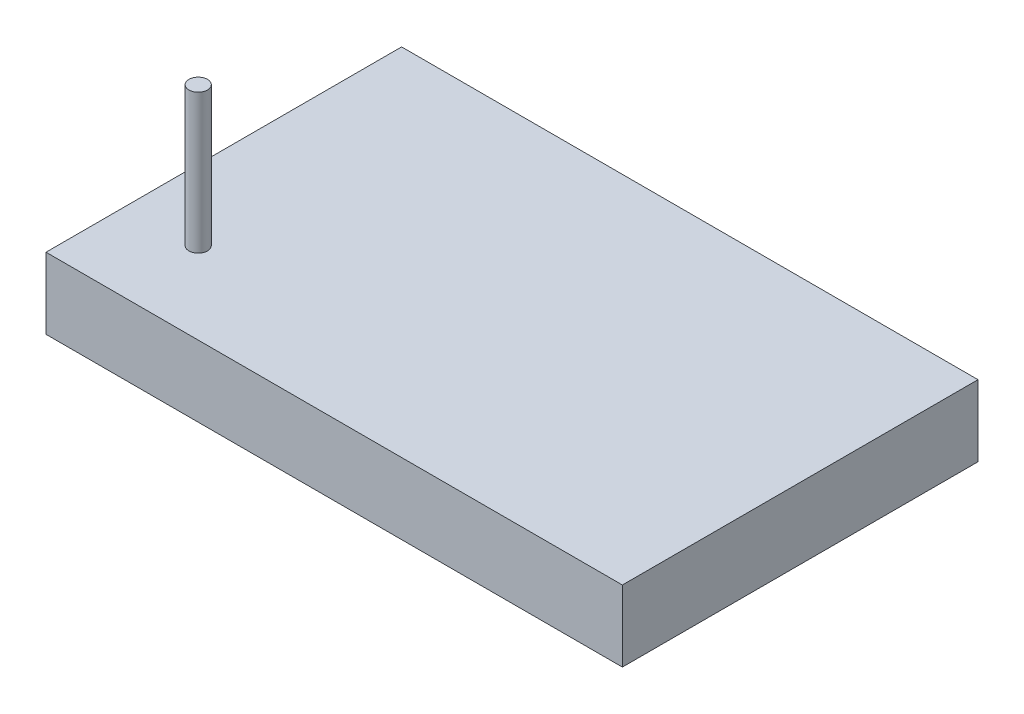
ISO-10303-21;
HEADER;
FILE_DESCRIPTION(('STEP AP214'),'2;1');
FILE_NAME('part.step','',(''),(''),'','','');
FILE_SCHEMA(('AUTOMOTIVE_DESIGN { 1 0 10303 214 1 1 1 1 }'));
ENDSEC;
DATA;
#1=APPLICATION_CONTEXT('core data for automotive mechanical design processes');
#2=APPLICATION_PROTOCOL_DEFINITION('international standard','automotive_design',2000,#1);
#3=PRODUCT_CONTEXT('',#1,'mechanical');
#4=PRODUCT('Part','Part','',(#3));
#5=PRODUCT_RELATED_PRODUCT_CATEGORY('part','',(#4));
#6=PRODUCT_DEFINITION_FORMATION('','',#4);
#7=PRODUCT_DEFINITION_CONTEXT('part definition',#1,'design');
#8=PRODUCT_DEFINITION('design','',#6,#7);
#9=PRODUCT_DEFINITION_SHAPE('','',#8);
#10=(LENGTH_UNIT() NAMED_UNIT(*) SI_UNIT(.MILLI.,.METRE.));
#11=(NAMED_UNIT(*) PLANE_ANGLE_UNIT() SI_UNIT($,.RADIAN.));
#12=(NAMED_UNIT(*) SI_UNIT($,.STERADIAN.) SOLID_ANGLE_UNIT());
#13=UNCERTAINTY_MEASURE_WITH_UNIT(LENGTH_MEASURE(1.E-05),#10,'distance_accuracy_value','');
#14=(GEOMETRIC_REPRESENTATION_CONTEXT(3) GLOBAL_UNCERTAINTY_ASSIGNED_CONTEXT((#13)) GLOBAL_UNIT_ASSIGNED_CONTEXT((#10,
#11,#12)) REPRESENTATION_CONTEXT('',''));
#15=CARTESIAN_POINT('',(0.,0.,0.));
#16=DIRECTION('',(0.,0.,1.));
#17=DIRECTION('',(1.,0.,0.));
#18=AXIS2_PLACEMENT_3D('',#15,#16,#17);
#19=CARTESIAN_POINT('',(0.,12.5,0.));
#20=DIRECTION('',(0.,-1.,0.));
#21=DIRECTION('',(0.,0.,-1.));
#22=AXIS2_PLACEMENT_3D('',#19,#20,#21);
#23=PLANE('',#22);
#24=DIRECTION('',(0.,0.,1.));
#25=VECTOR('',#24,1.);
#26=CARTESIAN_POINT('',(0.,12.5,0.));
#27=LINE('',#26,#25);
#28=CARTESIAN_POINT('',(0.,12.5,-62.5));
#29=VERTEX_POINT('',#28);
#30=CARTESIAN_POINT('',(0.,12.5,0.));
#31=VERTEX_POINT('',#30);
#32=EDGE_CURVE('E86',#29,#31,#27,.T.);
#33=ORIENTED_EDGE('',*,*,#32,.T.);
#34=DIRECTION('',(1.,0.,0.));
#35=VECTOR('',#34,1.);
#36=CARTESIAN_POINT('',(0.,12.5,0.));
#37=LINE('',#36,#35);
#38=CARTESIAN_POINT('',(101.3,12.5,0.));
#39=VERTEX_POINT('',#38);
#40=EDGE_CURVE('E81',#31,#39,#37,.T.);
#41=ORIENTED_EDGE('',*,*,#40,.T.);
#42=DIRECTION('',(0.,0.,-1.));
#43=VECTOR('',#42,1.);
#44=CARTESIAN_POINT('',(101.3,12.5,0.));
#45=LINE('',#44,#43);
#46=CARTESIAN_POINT('',(101.3,12.5,-62.5));
#47=VERTEX_POINT('',#46);
#48=EDGE_CURVE('E84',#39,#47,#45,.T.);
#49=ORIENTED_EDGE('',*,*,#48,.T.);
#50=DIRECTION('',(-1.,0.,0.));
#51=VECTOR('',#50,1.);
#52=CARTESIAN_POINT('',(0.,12.5,-62.5));
#53=LINE('',#52,#51);
#54=EDGE_CURVE('E50',#47,#29,#53,.T.);
#55=ORIENTED_EDGE('',*,*,#54,.T.);
#56=EDGE_LOOP('',(#33,#41,#49,#55));
#57=FACE_BOUND('',#56,.T.);
#58=CARTESIAN_POINT('',(12.375,12.5,-14.375));
#59=DIRECTION('',(0.,-1.,0.));
#60=DIRECTION('',(0.,0.,-1.));
#61=AXIS2_PLACEMENT_3D('',#58,#59,#60);
#62=CIRCLE('',#61,1.625);
#63=CARTESIAN_POINT('',(12.375,12.5,-16.));
#64=VERTEX_POINT('',#63);
#65=EDGE_CURVE('E11',#64,#64,#62,.F.);
#66=ORIENTED_EDGE('',*,*,#65,.F.);
#67=EDGE_LOOP('',(#66));
#68=FACE_BOUND('',#67,.T.);
#69=ADVANCED_FACE('F33',(#57,#68),#23,.F.);
#70=CARTESIAN_POINT('',(0.,12.5,0.));
#71=DIRECTION('',(1.,0.,0.));
#72=DIRECTION('',(0.,0.,-1.));
#73=AXIS2_PLACEMENT_3D('',#70,#71,#72);
#74=PLANE('',#73);
#75=DIRECTION('',(0.,0.,1.));
#76=VECTOR('',#75,1.);
#77=CARTESIAN_POINT('',(0.,0.,0.));
#78=LINE('',#77,#76);
#79=CARTESIAN_POINT('',(0.,0.,-62.5));
#80=VERTEX_POINT('',#79);
#81=CARTESIAN_POINT('',(0.,0.,0.));
#82=VERTEX_POINT('',#81);
#83=EDGE_CURVE('E100',#80,#82,#78,.T.);
#84=ORIENTED_EDGE('',*,*,#83,.T.);
#85=DIRECTION('',(0.,-1.,0.));
#86=VECTOR('',#85,1.);
#87=CARTESIAN_POINT('',(0.,12.5,0.));
#88=LINE('',#87,#86);
#89=EDGE_CURVE('E42',#31,#82,#88,.T.);
#90=ORIENTED_EDGE('',*,*,#89,.F.);
#91=ORIENTED_EDGE('',*,*,#32,.F.);
#92=DIRECTION('',(0.,-1.,0.));
#93=VECTOR('',#92,1.);
#94=CARTESIAN_POINT('',(0.,12.5,-62.5));
#95=LINE('',#94,#93);
#96=EDGE_CURVE('E96',#29,#80,#95,.T.);
#97=ORIENTED_EDGE('',*,*,#96,.T.);
#98=EDGE_LOOP('',(#84,#90,#91,#97));
#99=FACE_BOUND('',#98,.T.);
#100=ADVANCED_FACE('F35',(#99),#74,.F.);
#101=CARTESIAN_POINT('',(0.,12.5,0.));
#102=DIRECTION('',(0.,0.,-1.));
#103=DIRECTION('',(-1.,0.,0.));
#104=AXIS2_PLACEMENT_3D('',#101,#102,#103);
#105=PLANE('',#104);
#106=DIRECTION('',(1.,0.,0.));
#107=VECTOR('',#106,1.);
#108=CARTESIAN_POINT('',(0.,0.,0.));
#109=LINE('',#108,#107);
#110=CARTESIAN_POINT('',(101.3,0.,0.));
#111=VERTEX_POINT('',#110);
#112=EDGE_CURVE('E91',#82,#111,#109,.T.);
#113=ORIENTED_EDGE('',*,*,#112,.T.);
#114=DIRECTION('',(0.,-1.,0.));
#115=VECTOR('',#114,1.);
#116=CARTESIAN_POINT('',(101.3,12.5,0.));
#117=LINE('',#116,#115);
#118=EDGE_CURVE('E89',#39,#111,#117,.T.);
#119=ORIENTED_EDGE('',*,*,#118,.F.);
#120=ORIENTED_EDGE('',*,*,#40,.F.);
#121=ORIENTED_EDGE('',*,*,#89,.T.);
#122=EDGE_LOOP('',(#113,#119,#120,#121));
#123=FACE_BOUND('',#122,.T.);
#124=ADVANCED_FACE('F90',(#123),#105,.F.);
#125=CARTESIAN_POINT('',(101.3,12.5,0.));
#126=DIRECTION('',(-1.,0.,0.));
#127=DIRECTION('',(0.,0.,1.));
#128=AXIS2_PLACEMENT_3D('',#125,#126,#127);
#129=PLANE('',#128);
#130=DIRECTION('',(0.,0.,-1.));
#131=VECTOR('',#130,1.);
#132=CARTESIAN_POINT('',(101.3,0.,0.));
#133=LINE('',#132,#131);
#134=CARTESIAN_POINT('',(101.3,0.,-62.5));
#135=VERTEX_POINT('',#134);
#136=EDGE_CURVE('E67',#111,#135,#133,.T.);
#137=ORIENTED_EDGE('',*,*,#136,.T.);
#138=DIRECTION('',(0.,-1.,0.));
#139=VECTOR('',#138,1.);
#140=CARTESIAN_POINT('',(101.3,12.5,-62.5));
#141=LINE('',#140,#139);
#142=EDGE_CURVE('E92',#47,#135,#141,.T.);
#143=ORIENTED_EDGE('',*,*,#142,.F.);
#144=ORIENTED_EDGE('',*,*,#48,.F.);
#145=ORIENTED_EDGE('',*,*,#118,.T.);
#146=EDGE_LOOP('',(#137,#143,#144,#145));
#147=FACE_BOUND('',#146,.T.);
#148=ADVANCED_FACE('F94',(#147),#129,.F.);
#149=CARTESIAN_POINT('',(0.,12.5,-62.5));
#150=DIRECTION('',(0.,0.,1.));
#151=DIRECTION('',(1.,0.,0.));
#152=AXIS2_PLACEMENT_3D('',#149,#150,#151);
#153=PLANE('',#152);
#154=DIRECTION('',(-1.,0.,0.));
#155=VECTOR('',#154,1.);
#156=CARTESIAN_POINT('',(0.,0.,-62.5));
#157=LINE('',#156,#155);
#158=EDGE_CURVE('E73',#135,#80,#157,.T.);
#159=ORIENTED_EDGE('',*,*,#158,.T.);
#160=ORIENTED_EDGE('',*,*,#96,.F.);
#161=ORIENTED_EDGE('',*,*,#54,.F.);
#162=ORIENTED_EDGE('',*,*,#142,.T.);
#163=EDGE_LOOP('',(#159,#160,#161,#162));
#164=FACE_BOUND('',#163,.T.);
#165=ADVANCED_FACE('F114',(#164),#153,.F.);
#166=CARTESIAN_POINT('',(0.,0.,0.));
#167=DIRECTION('',(0.,-1.,0.));
#168=DIRECTION('',(0.,0.,-1.));
#169=AXIS2_PLACEMENT_3D('',#166,#167,#168);
#170=PLANE('',#169);
#171=ORIENTED_EDGE('',*,*,#83,.F.);
#172=ORIENTED_EDGE('',*,*,#158,.F.);
#173=ORIENTED_EDGE('',*,*,#136,.F.);
#174=ORIENTED_EDGE('',*,*,#112,.F.);
#175=EDGE_LOOP('',(#171,#172,#173,#174));
#176=FACE_BOUND('',#175,.T.);
#177=ADVANCED_FACE('F111',(#176),#170,.T.);
#178=CARTESIAN_POINT('',(12.375,37.,-14.375));
#179=DIRECTION('',(0.,-1.,0.));
#180=DIRECTION('',(0.,0.,-1.));
#181=AXIS2_PLACEMENT_3D('',#178,#179,#180);
#182=CYLINDRICAL_SURFACE('',#181,1.625);
#183=CARTESIAN_POINT('',(12.375,37.,-14.375));
#184=DIRECTION('',(0.,1.,0.));
#185=DIRECTION('',(0.,0.,1.));
#186=AXIS2_PLACEMENT_3D('',#183,#184,#185);
#187=CIRCLE('',#186,1.625);
#188=CARTESIAN_POINT('',(12.375,37.,-12.75));
#189=VERTEX_POINT('',#188);
#190=EDGE_CURVE('E103',#189,#189,#187,.T.);
#191=ORIENTED_EDGE('',*,*,#190,.F.);
#192=EDGE_LOOP('',(#191));
#193=FACE_BOUND('',#192,.T.);
#194=ORIENTED_EDGE('',*,*,#65,.T.);
#195=EDGE_LOOP('',(#194));
#196=FACE_BOUND('',#195,.T.);
#197=ADVANCED_FACE('F113',(#193,#196),#182,.T.);
#198=CARTESIAN_POINT('',(12.375,37.,-14.375));
#199=DIRECTION('',(0.,1.,0.));
#200=DIRECTION('',(0.,0.,1.));
#201=AXIS2_PLACEMENT_3D('',#198,#199,#200);
#202=PLANE('',#201);
#203=ORIENTED_EDGE('',*,*,#190,.T.);
#204=EDGE_LOOP('',(#203));
#205=FACE_BOUND('',#204,.T.);
#206=ADVANCED_FACE('F120',(#205),#202,.T.);
#207=CLOSED_SHELL('',(#69,#100,#124,#148,#165,#177,#197,#206));
#208=MANIFOLD_SOLID_BREP('B2',#207);
#209=ADVANCED_BREP_SHAPE_REPRESENTATION('',(#18,#208),#14);
#210=SHAPE_DEFINITION_REPRESENTATION(#9,#209);
ENDSEC;
END-ISO-10303-21;
